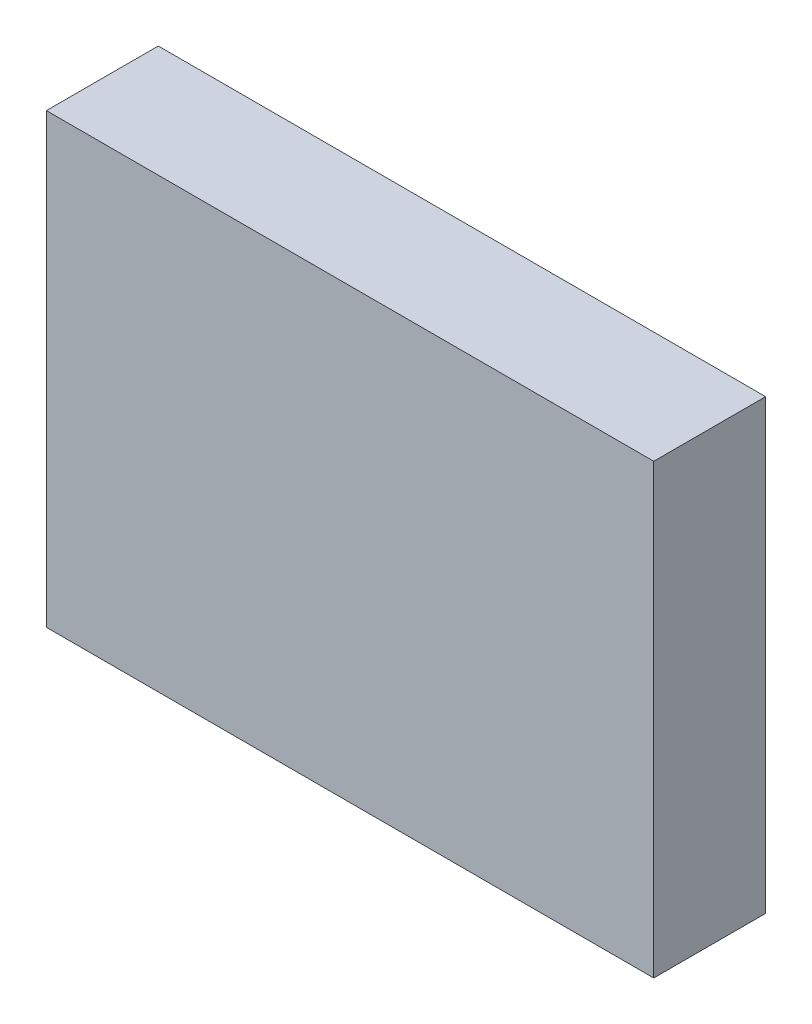
ISO-10303-21;
HEADER;
FILE_DESCRIPTION(('STEP AP214'),'2;1');
FILE_NAME('part.step','',(''),(''),'','','');
FILE_SCHEMA(('AUTOMOTIVE_DESIGN { 1 0 10303 214 1 1 1 1 }'));
ENDSEC;
DATA;
#1=APPLICATION_CONTEXT('core data for automotive mechanical design processes');
#2=APPLICATION_PROTOCOL_DEFINITION('international standard','automotive_design',2000,#1);
#3=PRODUCT_CONTEXT('',#1,'mechanical');
#4=PRODUCT('Part','Part','',(#3));
#5=PRODUCT_RELATED_PRODUCT_CATEGORY('part','',(#4));
#6=PRODUCT_DEFINITION_FORMATION('','',#4);
#7=PRODUCT_DEFINITION_CONTEXT('part definition',#1,'design');
#8=PRODUCT_DEFINITION('design','',#6,#7);
#9=PRODUCT_DEFINITION_SHAPE('','',#8);
#10=(LENGTH_UNIT() NAMED_UNIT(*) SI_UNIT(.MILLI.,.METRE.));
#11=(NAMED_UNIT(*) PLANE_ANGLE_UNIT() SI_UNIT($,.RADIAN.));
#12=(NAMED_UNIT(*) SI_UNIT($,.STERADIAN.) SOLID_ANGLE_UNIT());
#13=UNCERTAINTY_MEASURE_WITH_UNIT(LENGTH_MEASURE(1.E-05),#10,'distance_accuracy_value','');
#14=(GEOMETRIC_REPRESENTATION_CONTEXT(3) GLOBAL_UNCERTAINTY_ASSIGNED_CONTEXT((#13)) GLOBAL_UNIT_ASSIGNED_CONTEXT((#10,
#11,#12)) REPRESENTATION_CONTEXT('',''));
#15=CARTESIAN_POINT('',(0.,0.,0.));
#16=DIRECTION('',(0.,0.,1.));
#17=DIRECTION('',(1.,0.,0.));
#18=AXIS2_PLACEMENT_3D('',#15,#16,#17);
#19=CARTESIAN_POINT('',(-1.9,-1.4,0.7));
#20=DIRECTION('',(0.,1.,0.));
#21=DIRECTION('',(0.,0.,1.));
#22=AXIS2_PLACEMENT_3D('',#19,#20,#21);
#23=PLANE('',#22);
#24=DIRECTION('',(1.,0.,0.));
#25=VECTOR('',#24,1.);
#26=CARTESIAN_POINT('',(-1.9,-1.4,0.));
#27=LINE('',#26,#25);
#28=CARTESIAN_POINT('',(-1.9,-1.4,0.));
#29=VERTEX_POINT('',#28);
#30=CARTESIAN_POINT('',(1.9,-1.4,0.));
#31=VERTEX_POINT('',#30);
#32=EDGE_CURVE('E97',#29,#31,#27,.T.);
#33=ORIENTED_EDGE('',*,*,#32,.T.);
#34=DIRECTION('',(0.,0.,-1.));
#35=VECTOR('',#34,1.);
#36=CARTESIAN_POINT('',(1.9,-1.4,0.7));
#37=LINE('',#36,#35);
#38=CARTESIAN_POINT('',(1.9,-1.4,0.7));
#39=VERTEX_POINT('',#38);
#40=EDGE_CURVE('E11',#39,#31,#37,.T.);
#41=ORIENTED_EDGE('',*,*,#40,.F.);
#42=DIRECTION('',(1.,0.,0.));
#43=VECTOR('',#42,1.);
#44=CARTESIAN_POINT('',(-1.9,-1.4,0.7));
#45=LINE('',#44,#43);
#46=CARTESIAN_POINT('',(-1.9,-1.4,0.7));
#47=VERTEX_POINT('',#46);
#48=EDGE_CURVE('E85',#47,#39,#45,.T.);
#49=ORIENTED_EDGE('',*,*,#48,.F.);
#50=DIRECTION('',(0.,0.,-1.));
#51=VECTOR('',#50,1.);
#52=CARTESIAN_POINT('',(-1.9,-1.4,0.7));
#53=LINE('',#52,#51);
#54=EDGE_CURVE('E93',#47,#29,#53,.T.);
#55=ORIENTED_EDGE('',*,*,#54,.T.);
#56=EDGE_LOOP('',(#33,#41,#49,#55));
#57=FACE_BOUND('',#56,.T.);
#58=ADVANCED_FACE('F34',(#57),#23,.F.);
#59=CARTESIAN_POINT('',(1.9,-1.4,0.7));
#60=DIRECTION('',(-1.,0.,0.));
#61=DIRECTION('',(0.,0.,1.));
#62=AXIS2_PLACEMENT_3D('',#59,#60,#61);
#63=PLANE('',#62);
#64=DIRECTION('',(0.,1.,0.));
#65=VECTOR('',#64,1.);
#66=CARTESIAN_POINT('',(1.9,-1.4,0.));
#67=LINE('',#66,#65);
#68=CARTESIAN_POINT('',(1.9,1.4,0.));
#69=VERTEX_POINT('',#68);
#70=EDGE_CURVE('E89',#31,#69,#67,.T.);
#71=ORIENTED_EDGE('',*,*,#70,.T.);
#72=DIRECTION('',(0.,0.,-1.));
#73=VECTOR('',#72,1.);
#74=CARTESIAN_POINT('',(1.9,1.4,0.7));
#75=LINE('',#74,#73);
#76=CARTESIAN_POINT('',(1.9,1.4,0.7));
#77=VERTEX_POINT('',#76);
#78=EDGE_CURVE('E42',#77,#69,#75,.T.);
#79=ORIENTED_EDGE('',*,*,#78,.F.);
#80=DIRECTION('',(0.,1.,0.));
#81=VECTOR('',#80,1.);
#82=CARTESIAN_POINT('',(1.9,-1.4,0.7));
#83=LINE('',#82,#81);
#84=EDGE_CURVE('E80',#39,#77,#83,.T.);
#85=ORIENTED_EDGE('',*,*,#84,.F.);
#86=ORIENTED_EDGE('',*,*,#40,.T.);
#87=EDGE_LOOP('',(#71,#79,#85,#86));
#88=FACE_BOUND('',#87,.T.);
#89=ADVANCED_FACE('F88',(#88),#63,.F.);
#90=CARTESIAN_POINT('',(1.9,1.4,0.7));
#91=DIRECTION('',(0.,-1.,0.));
#92=DIRECTION('',(0.,0.,-1.));
#93=AXIS2_PLACEMENT_3D('',#90,#91,#92);
#94=PLANE('',#93);
#95=DIRECTION('',(-1.,0.,0.));
#96=VECTOR('',#95,1.);
#97=CARTESIAN_POINT('',(1.9,1.4,0.));
#98=LINE('',#97,#96);
#99=CARTESIAN_POINT('',(-1.9,1.4,0.));
#100=VERTEX_POINT('',#99);
#101=EDGE_CURVE('E67',#69,#100,#98,.T.);
#102=ORIENTED_EDGE('',*,*,#101,.T.);
#103=DIRECTION('',(0.,0.,-1.));
#104=VECTOR('',#103,1.);
#105=CARTESIAN_POINT('',(-1.9,1.4,0.7));
#106=LINE('',#105,#104);
#107=CARTESIAN_POINT('',(-1.9,1.4,0.7));
#108=VERTEX_POINT('',#107);
#109=EDGE_CURVE('E90',#108,#100,#106,.T.);
#110=ORIENTED_EDGE('',*,*,#109,.F.);
#111=DIRECTION('',(-1.,0.,0.));
#112=VECTOR('',#111,1.);
#113=CARTESIAN_POINT('',(1.9,1.4,0.7));
#114=LINE('',#113,#112);
#115=EDGE_CURVE('E83',#77,#108,#114,.T.);
#116=ORIENTED_EDGE('',*,*,#115,.F.);
#117=ORIENTED_EDGE('',*,*,#78,.T.);
#118=EDGE_LOOP('',(#102,#110,#116,#117));
#119=FACE_BOUND('',#118,.T.);
#120=ADVANCED_FACE('F91',(#119),#94,.F.);
#121=CARTESIAN_POINT('',(-1.9,1.4,0.7));
#122=DIRECTION('',(1.,0.,0.));
#123=DIRECTION('',(0.,0.,-1.));
#124=AXIS2_PLACEMENT_3D('',#121,#122,#123);
#125=PLANE('',#124);
#126=DIRECTION('',(0.,-1.,0.));
#127=VECTOR('',#126,1.);
#128=CARTESIAN_POINT('',(-1.9,1.4,0.));
#129=LINE('',#128,#127);
#130=EDGE_CURVE('E73',#100,#29,#129,.T.);
#131=ORIENTED_EDGE('',*,*,#130,.T.);
#132=ORIENTED_EDGE('',*,*,#54,.F.);
#133=DIRECTION('',(0.,-1.,0.));
#134=VECTOR('',#133,1.);
#135=CARTESIAN_POINT('',(-1.9,1.4,0.7));
#136=LINE('',#135,#134);
#137=EDGE_CURVE('E50',#108,#47,#136,.T.);
#138=ORIENTED_EDGE('',*,*,#137,.F.);
#139=ORIENTED_EDGE('',*,*,#109,.T.);
#140=EDGE_LOOP('',(#131,#132,#138,#139));
#141=FACE_BOUND('',#140,.T.);
#142=ADVANCED_FACE('F104',(#141),#125,.F.);
#143=CARTESIAN_POINT('',(0.,0.,0.7));
#144=DIRECTION('',(0.,0.,1.));
#145=DIRECTION('',(1.,0.,0.));
#146=AXIS2_PLACEMENT_3D('',#143,#144,#145);
#147=PLANE('',#146);
#148=ORIENTED_EDGE('',*,*,#48,.T.);
#149=ORIENTED_EDGE('',*,*,#84,.T.);
#150=ORIENTED_EDGE('',*,*,#115,.T.);
#151=ORIENTED_EDGE('',*,*,#137,.T.);
#152=EDGE_LOOP('',(#148,#149,#150,#151));
#153=FACE_BOUND('',#152,.T.);
#154=ADVANCED_FACE('F81',(#153),#147,.T.);
#155=CARTESIAN_POINT('',(0.,0.,0.));
#156=DIRECTION('',(0.,0.,1.));
#157=DIRECTION('',(1.,0.,0.));
#158=AXIS2_PLACEMENT_3D('',#155,#156,#157);
#159=PLANE('',#158);
#160=ORIENTED_EDGE('',*,*,#32,.F.);
#161=ORIENTED_EDGE('',*,*,#130,.F.);
#162=ORIENTED_EDGE('',*,*,#101,.F.);
#163=ORIENTED_EDGE('',*,*,#70,.F.);
#164=EDGE_LOOP('',(#160,#161,#162,#163));
#165=FACE_BOUND('',#164,.T.);
#166=ADVANCED_FACE('F107',(#165),#159,.F.);
#167=CLOSED_SHELL('',(#58,#89,#120,#142,#154,#166));
#168=MANIFOLD_SOLID_BREP('B2',#167);
#169=ADVANCED_BREP_SHAPE_REPRESENTATION('',(#18,#168),#14);
#170=SHAPE_DEFINITION_REPRESENTATION(#9,#169);
ENDSEC;
END-ISO-10303-21;
